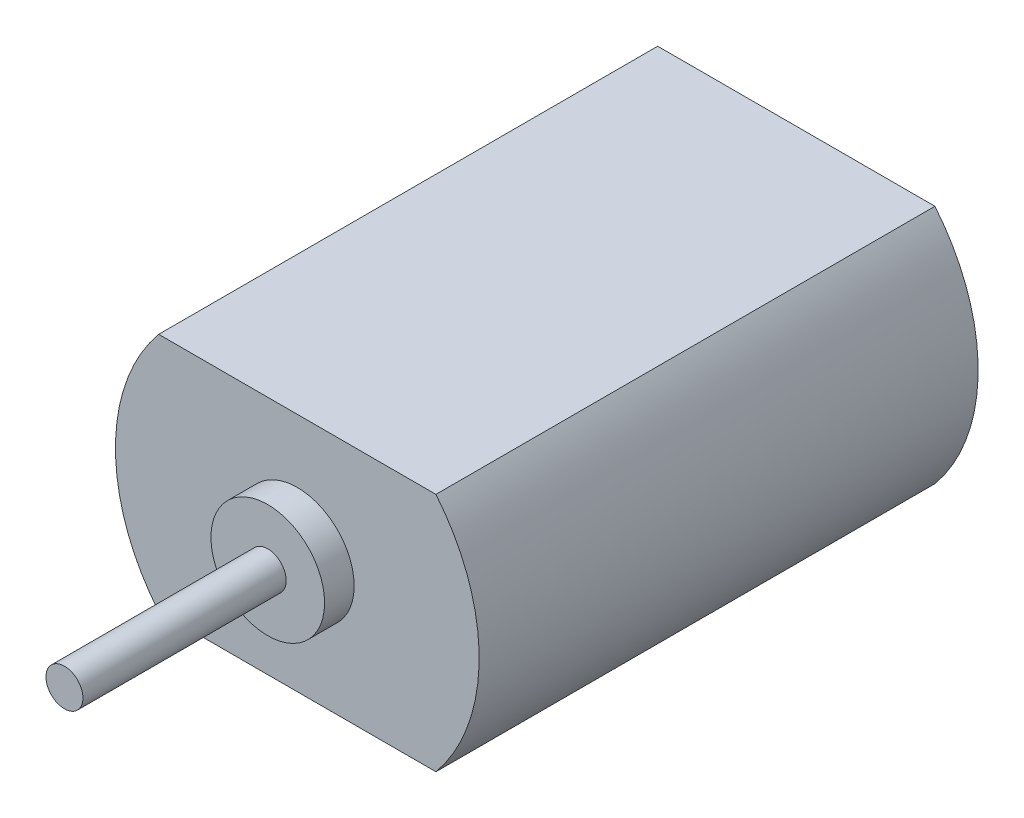
ISO-10303-21;
HEADER;
FILE_DESCRIPTION(('STEP AP214'),'2;1');
FILE_NAME('part.step','',(''),(''),'','','');
FILE_SCHEMA(('AUTOMOTIVE_DESIGN { 1 0 10303 214 1 1 1 1 }'));
ENDSEC;
DATA;
#1=APPLICATION_CONTEXT('core data for automotive mechanical design processes');
#2=APPLICATION_PROTOCOL_DEFINITION('international standard','automotive_design',2000,#1);
#3=PRODUCT_CONTEXT('',#1,'mechanical');
#4=PRODUCT('Part','Part','',(#3));
#5=PRODUCT_RELATED_PRODUCT_CATEGORY('part','',(#4));
#6=PRODUCT_DEFINITION_FORMATION('','',#4);
#7=PRODUCT_DEFINITION_CONTEXT('part definition',#1,'design');
#8=PRODUCT_DEFINITION('design','',#6,#7);
#9=PRODUCT_DEFINITION_SHAPE('','',#8);
#10=(LENGTH_UNIT() NAMED_UNIT(*) SI_UNIT(.MILLI.,.METRE.));
#11=(NAMED_UNIT(*) PLANE_ANGLE_UNIT() SI_UNIT($,.RADIAN.));
#12=(NAMED_UNIT(*) SI_UNIT($,.STERADIAN.) SOLID_ANGLE_UNIT());
#13=UNCERTAINTY_MEASURE_WITH_UNIT(LENGTH_MEASURE(1.E-05),#10,'distance_accuracy_value','');
#14=(GEOMETRIC_REPRESENTATION_CONTEXT(3) GLOBAL_UNCERTAINTY_ASSIGNED_CONTEXT((#13)) GLOBAL_UNIT_ASSIGNED_CONTEXT((#10,
#11,#12)) REPRESENTATION_CONTEXT('',''));
#15=CARTESIAN_POINT('',(0.,0.,0.));
#16=DIRECTION('',(0.,0.,1.));
#17=DIRECTION('',(1.,0.,0.));
#18=AXIS2_PLACEMENT_3D('',#15,#16,#17);
#19=CARTESIAN_POINT('',(0.,-6.5,27.));
#20=DIRECTION('',(0.,1.,0.));
#21=DIRECTION('',(0.,0.,1.));
#22=AXIS2_PLACEMENT_3D('',#19,#20,#21);
#23=PLANE('',#22);
#24=DIRECTION('',(1.,0.,0.));
#25=VECTOR('',#24,1.);
#26=CARTESIAN_POINT('',(0.,-6.5,0.));
#27=LINE('',#26,#25);
#28=CARTESIAN_POINT('',(-7.5,-6.5,0.));
#29=VERTEX_POINT('',#28);
#30=CARTESIAN_POINT('',(7.5,-6.5,0.));
#31=VERTEX_POINT('',#30);
#32=EDGE_CURVE('E106',#29,#31,#27,.T.);
#33=ORIENTED_EDGE('',*,*,#32,.T.);
#34=DIRECTION('',(0.,0.,-1.));
#35=VECTOR('',#34,1.);
#36=CARTESIAN_POINT('',(7.5,-6.5,27.));
#37=LINE('',#36,#35);
#38=CARTESIAN_POINT('',(7.5,-6.5,27.));
#39=VERTEX_POINT('',#38);
#40=EDGE_CURVE('E43',#39,#31,#37,.T.);
#41=ORIENTED_EDGE('',*,*,#40,.F.);
#42=DIRECTION('',(1.,0.,0.));
#43=VECTOR('',#42,1.);
#44=CARTESIAN_POINT('',(0.,-6.5,27.));
#45=LINE('',#44,#43);
#46=CARTESIAN_POINT('',(-7.5,-6.5,27.));
#47=VERTEX_POINT('',#46);
#48=EDGE_CURVE('E82',#47,#39,#45,.T.);
#49=ORIENTED_EDGE('',*,*,#48,.F.);
#50=DIRECTION('',(0.,0.,-1.));
#51=VECTOR('',#50,1.);
#52=CARTESIAN_POINT('',(-7.5,-6.5,27.));
#53=LINE('',#52,#51);
#54=EDGE_CURVE('E102',#47,#29,#53,.T.);
#55=ORIENTED_EDGE('',*,*,#54,.T.);
#56=EDGE_LOOP('',(#33,#41,#49,#55));
#57=FACE_BOUND('',#56,.T.);
#58=ADVANCED_FACE('F40',(#57),#23,.F.);
#59=CARTESIAN_POINT('',(-0.360661549767933,0.,27.));
#60=DIRECTION('',(0.,0.,-1.));
#61=DIRECTION('',(-1.,0.,0.));
#62=AXIS2_PLACEMENT_3D('',#59,#60,#61);
#63=CYLINDRICAL_SURFACE('',#62,10.2);
#64=CARTESIAN_POINT('',(-0.360661549767933,0.,0.));
#65=DIRECTION('',(0.,0.,1.));
#66=DIRECTION('',(1.,0.,0.));
#67=AXIS2_PLACEMENT_3D('',#64,#65,#66);
#68=CIRCLE('',#67,10.2);
#69=CARTESIAN_POINT('',(7.5,6.5,0.));
#70=VERTEX_POINT('',#69);
#71=EDGE_CURVE('E92',#70,#31,#68,.F.);
#72=ORIENTED_EDGE('',*,*,#71,.F.);
#73=DIRECTION('',(0.,0.,-1.));
#74=VECTOR('',#73,1.);
#75=CARTESIAN_POINT('',(7.5,6.5,27.));
#76=LINE('',#75,#74);
#77=CARTESIAN_POINT('',(7.5,6.5,27.));
#78=VERTEX_POINT('',#77);
#79=EDGE_CURVE('E88',#78,#70,#76,.T.);
#80=ORIENTED_EDGE('',*,*,#79,.F.);
#81=CARTESIAN_POINT('',(-0.360661549767933,0.,27.));
#82=DIRECTION('',(0.,0.,1.));
#83=DIRECTION('',(1.,0.,0.));
#84=AXIS2_PLACEMENT_3D('',#81,#82,#83);
#85=CIRCLE('',#84,10.2);
#86=EDGE_CURVE('E90',#78,#39,#85,.F.);
#87=ORIENTED_EDGE('',*,*,#86,.T.);
#88=ORIENTED_EDGE('',*,*,#40,.T.);
#89=EDGE_LOOP('',(#72,#80,#87,#88));
#90=FACE_BOUND('',#89,.T.);
#91=ADVANCED_FACE('F89',(#90),#63,.T.);
#92=CARTESIAN_POINT('',(0.,6.5,27.));
#93=DIRECTION('',(0.,1.,0.));
#94=DIRECTION('',(0.,0.,1.));
#95=AXIS2_PLACEMENT_3D('',#92,#93,#94);
#96=PLANE('',#95);
#97=DIRECTION('',(1.,0.,0.));
#98=VECTOR('',#97,1.);
#99=CARTESIAN_POINT('',(0.,6.5,0.));
#100=LINE('',#99,#98);
#101=CARTESIAN_POINT('',(-7.5,6.5,0.));
#102=VERTEX_POINT('',#101);
#103=EDGE_CURVE('E111',#102,#70,#100,.T.);
#104=ORIENTED_EDGE('',*,*,#103,.F.);
#105=DIRECTION('',(0.,0.,-1.));
#106=VECTOR('',#105,1.);
#107=CARTESIAN_POINT('',(-7.5,6.5,27.));
#108=LINE('',#107,#106);
#109=CARTESIAN_POINT('',(-7.5,6.5,27.));
#110=VERTEX_POINT('',#109);
#111=EDGE_CURVE('E74',#110,#102,#108,.T.);
#112=ORIENTED_EDGE('',*,*,#111,.F.);
#113=DIRECTION('',(1.,0.,0.));
#114=VECTOR('',#113,1.);
#115=CARTESIAN_POINT('',(0.,6.5,27.));
#116=LINE('',#115,#114);
#117=EDGE_CURVE('E98',#110,#78,#116,.T.);
#118=ORIENTED_EDGE('',*,*,#117,.T.);
#119=ORIENTED_EDGE('',*,*,#79,.T.);
#120=EDGE_LOOP('',(#104,#112,#118,#119));
#121=FACE_BOUND('',#120,.T.);
#122=ADVANCED_FACE('F100',(#121),#96,.T.);
#123=CARTESIAN_POINT('',(0.360661549767933,0.,27.));
#124=DIRECTION('',(0.,0.,-1.));
#125=DIRECTION('',(-1.,0.,0.));
#126=AXIS2_PLACEMENT_3D('',#123,#124,#125);
#127=CYLINDRICAL_SURFACE('',#126,10.2);
#128=CARTESIAN_POINT('',(0.360661549767933,0.,0.));
#129=DIRECTION('',(0.,0.,1.));
#130=DIRECTION('',(1.,0.,0.));
#131=AXIS2_PLACEMENT_3D('',#128,#129,#130);
#132=CIRCLE('',#131,10.2);
#133=EDGE_CURVE('E77',#102,#29,#132,.T.);
#134=ORIENTED_EDGE('',*,*,#133,.T.);
#135=ORIENTED_EDGE('',*,*,#54,.F.);
#136=CARTESIAN_POINT('',(0.360661549767933,0.,27.));
#137=DIRECTION('',(0.,0.,1.));
#138=DIRECTION('',(1.,0.,0.));
#139=AXIS2_PLACEMENT_3D('',#136,#137,#138);
#140=CIRCLE('',#139,10.2);
#141=EDGE_CURVE('E58',#110,#47,#140,.T.);
#142=ORIENTED_EDGE('',*,*,#141,.F.);
#143=ORIENTED_EDGE('',*,*,#111,.T.);
#144=EDGE_LOOP('',(#134,#135,#142,#143));
#145=FACE_BOUND('',#144,.T.);
#146=ADVANCED_FACE('F129',(#145),#127,.T.);
#147=CARTESIAN_POINT('',(0.,0.,27.));
#148=DIRECTION('',(0.,0.,1.));
#149=DIRECTION('',(1.,0.,0.));
#150=AXIS2_PLACEMENT_3D('',#147,#148,#149);
#151=PLANE('',#150);
#152=CARTESIAN_POINT('',(0.,0.,27.));
#153=DIRECTION('',(0.,0.,1.));
#154=DIRECTION('',(1.,0.,0.));
#155=AXIS2_PLACEMENT_3D('',#152,#153,#154);
#156=CIRCLE('',#155,3.075);
#157=CARTESIAN_POINT('',(3.075,0.,27.));
#158=VERTEX_POINT('',#157);
#159=EDGE_CURVE('E49',#158,#158,#156,.T.);
#160=ORIENTED_EDGE('',*,*,#159,.F.);
#161=EDGE_LOOP('',(#160));
#162=FACE_BOUND('',#161,.T.);
#163=ORIENTED_EDGE('',*,*,#48,.T.);
#164=ORIENTED_EDGE('',*,*,#86,.F.);
#165=ORIENTED_EDGE('',*,*,#117,.F.);
#166=ORIENTED_EDGE('',*,*,#141,.T.);
#167=EDGE_LOOP('',(#163,#164,#165,#166));
#168=FACE_BOUND('',#167,.T.);
#169=ADVANCED_FACE('F97',(#162,#168),#151,.T.);
#170=CARTESIAN_POINT('',(0.,0.,0.));
#171=DIRECTION('',(0.,0.,1.));
#172=DIRECTION('',(1.,0.,0.));
#173=AXIS2_PLACEMENT_3D('',#170,#171,#172);
#174=PLANE('',#173);
#175=ORIENTED_EDGE('',*,*,#32,.F.);
#176=ORIENTED_EDGE('',*,*,#133,.F.);
#177=ORIENTED_EDGE('',*,*,#103,.T.);
#178=ORIENTED_EDGE('',*,*,#71,.T.);
#179=EDGE_LOOP('',(#175,#176,#177,#178));
#180=FACE_BOUND('',#179,.T.);
#181=ADVANCED_FACE('F118',(#180),#174,.F.);
#182=CARTESIAN_POINT('',(0.,0.,28.6));
#183=DIRECTION('',(0.,0.,-1.));
#184=DIRECTION('',(-1.,0.,0.));
#185=AXIS2_PLACEMENT_3D('',#182,#183,#184);
#186=CYLINDRICAL_SURFACE('',#185,3.075);
#187=CARTESIAN_POINT('',(0.,0.,28.6));
#188=DIRECTION('',(0.,0.,1.));
#189=DIRECTION('',(1.,0.,0.));
#190=AXIS2_PLACEMENT_3D('',#187,#188,#189);
#191=CIRCLE('',#190,3.075);
#192=CARTESIAN_POINT('',(3.075,0.,28.6));
#193=VERTEX_POINT('',#192);
#194=EDGE_CURVE('E109',#193,#193,#191,.T.);
#195=ORIENTED_EDGE('',*,*,#194,.F.);
#196=EDGE_LOOP('',(#195));
#197=FACE_BOUND('',#196,.T.);
#198=ORIENTED_EDGE('',*,*,#159,.T.);
#199=EDGE_LOOP('',(#198));
#200=FACE_BOUND('',#199,.T.);
#201=ADVANCED_FACE('F120',(#197,#200),#186,.T.);
#202=CARTESIAN_POINT('',(0.,0.,28.6));
#203=DIRECTION('',(0.,0.,1.));
#204=DIRECTION('',(1.,0.,0.));
#205=AXIS2_PLACEMENT_3D('',#202,#203,#204);
#206=PLANE('',#205);
#207=CARTESIAN_POINT('',(0.,0.,28.6));
#208=DIRECTION('',(0.,0.,1.));
#209=DIRECTION('',(1.,0.,0.));
#210=AXIS2_PLACEMENT_3D('',#207,#208,#209);
#211=CIRCLE('',#210,1.);
#212=CARTESIAN_POINT('',(1.,0.,28.6));
#213=VERTEX_POINT('',#212);
#214=EDGE_CURVE('E11',#213,#213,#211,.T.);
#215=ORIENTED_EDGE('',*,*,#214,.F.);
#216=EDGE_LOOP('',(#215));
#217=FACE_BOUND('',#216,.T.);
#218=ORIENTED_EDGE('',*,*,#194,.T.);
#219=EDGE_LOOP('',(#218));
#220=FACE_BOUND('',#219,.T.);
#221=ADVANCED_FACE('F126',(#217,#220),#206,.T.);
#222=CARTESIAN_POINT('',(0.,0.,39.6));
#223=DIRECTION('',(0.,0.,-1.));
#224=DIRECTION('',(-1.,0.,0.));
#225=AXIS2_PLACEMENT_3D('',#222,#223,#224);
#226=CYLINDRICAL_SURFACE('',#225,1.);
#227=CARTESIAN_POINT('',(0.,0.,39.6));
#228=DIRECTION('',(0.,0.,1.));
#229=DIRECTION('',(1.,0.,0.));
#230=AXIS2_PLACEMENT_3D('',#227,#228,#229);
#231=CIRCLE('',#230,1.);
#232=CARTESIAN_POINT('',(1.,0.,39.6));
#233=VERTEX_POINT('',#232);
#234=EDGE_CURVE('E195',#233,#233,#231,.T.);
#235=ORIENTED_EDGE('',*,*,#234,.F.);
#236=EDGE_LOOP('',(#235));
#237=FACE_BOUND('',#236,.T.);
#238=ORIENTED_EDGE('',*,*,#214,.T.);
#239=EDGE_LOOP('',(#238));
#240=FACE_BOUND('',#239,.T.);
#241=ADVANCED_FACE('F169',(#237,#240),#226,.T.);
#242=CARTESIAN_POINT('',(0.,0.,39.6));
#243=DIRECTION('',(0.,0.,1.));
#244=DIRECTION('',(1.,0.,0.));
#245=AXIS2_PLACEMENT_3D('',#242,#243,#244);
#246=PLANE('',#245);
#247=ORIENTED_EDGE('',*,*,#234,.T.);
#248=EDGE_LOOP('',(#247));
#249=FACE_BOUND('',#248,.T.);
#250=ADVANCED_FACE('F179',(#249),#246,.T.);
#251=CLOSED_SHELL('',(#58,#91,#122,#146,#169,#181,#201,#221,#241,#250));
#252=MANIFOLD_SOLID_BREP('B2',#251);
#253=ADVANCED_BREP_SHAPE_REPRESENTATION('',(#18,#252),#14);
#254=SHAPE_DEFINITION_REPRESENTATION(#9,#253);
ENDSEC;
END-ISO-10303-21;
